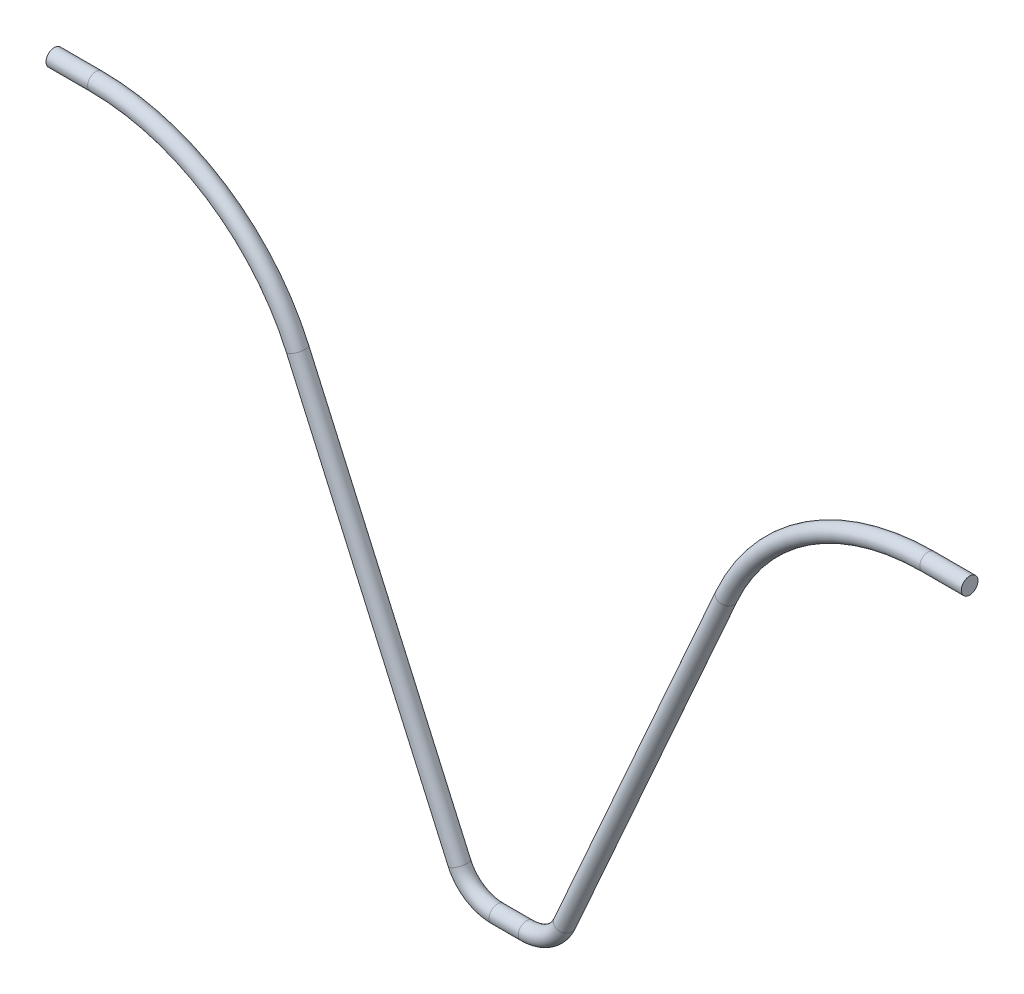
ISO-10303-21;
HEADER;
FILE_DESCRIPTION(('STEP AP214'),'2;1');
FILE_NAME('part.step','',(''),(''),'','','');
FILE_SCHEMA(('AUTOMOTIVE_DESIGN { 1 0 10303 214 1 1 1 1 }'));
ENDSEC;
DATA;
#1=APPLICATION_CONTEXT('core data for automotive mechanical design processes');
#2=APPLICATION_PROTOCOL_DEFINITION('international standard','automotive_design',2000,#1);
#3=PRODUCT_CONTEXT('',#1,'mechanical');
#4=PRODUCT('Part','Part','',(#3));
#5=PRODUCT_RELATED_PRODUCT_CATEGORY('part','',(#4));
#6=PRODUCT_DEFINITION_FORMATION('','',#4);
#7=PRODUCT_DEFINITION_CONTEXT('part definition',#1,'design');
#8=PRODUCT_DEFINITION('design','',#6,#7);
#9=PRODUCT_DEFINITION_SHAPE('','',#8);
#10=(LENGTH_UNIT() NAMED_UNIT(*) SI_UNIT(.MILLI.,.METRE.));
#11=(NAMED_UNIT(*) PLANE_ANGLE_UNIT() SI_UNIT($,.RADIAN.));
#12=(NAMED_UNIT(*) SI_UNIT($,.STERADIAN.) SOLID_ANGLE_UNIT());
#13=UNCERTAINTY_MEASURE_WITH_UNIT(LENGTH_MEASURE(1.E-05),#10,'distance_accuracy_value','');
#14=(GEOMETRIC_REPRESENTATION_CONTEXT(3) GLOBAL_UNCERTAINTY_ASSIGNED_CONTEXT((#13)) GLOBAL_UNIT_ASSIGNED_CONTEXT((#10,
#11,#12)) REPRESENTATION_CONTEXT('',''));
#15=CARTESIAN_POINT('',(0.,0.,0.));
#16=DIRECTION('',(0.,0.,1.));
#17=DIRECTION('',(1.,0.,0.));
#18=AXIS2_PLACEMENT_3D('',#15,#16,#17);
#19=CARTESIAN_POINT('',(110.,125.,0.));
#20=DIRECTION('',(1.,0.,0.));
#21=DIRECTION('',(0.,0.,-1.));
#22=AXIS2_PLACEMENT_3D('',#19,#20,#21);
#23=PLANE('',#22);
#24=CARTESIAN_POINT('',(110.,125.,0.));
#25=DIRECTION('',(1.,0.,0.));
#26=DIRECTION('',(0.,0.,-1.));
#27=AXIS2_PLACEMENT_3D('',#24,#25,#26);
#28=CIRCLE('',#27,2.);
#29=CARTESIAN_POINT('',(110.,125.,-2.));
#30=VERTEX_POINT('',#29);
#31=EDGE_CURVE('E65',#30,#30,#28,.T.);
#32=ORIENTED_EDGE('',*,*,#31,.T.);
#33=EDGE_LOOP('',(#32));
#34=FACE_BOUND('',#33,.T.);
#35=ADVANCED_FACE('F31',(#34),#23,.T.);
#36=CARTESIAN_POINT('',(-110.,125.,0.));
#37=DIRECTION('',(1.,0.,0.));
#38=DIRECTION('',(0.,0.,-1.));
#39=AXIS2_PLACEMENT_3D('',#36,#37,#38);
#40=PLANE('',#39);
#41=CARTESIAN_POINT('',(-110.,125.,0.));
#42=DIRECTION('',(1.,0.,0.));
#43=DIRECTION('',(0.,0.,-1.));
#44=AXIS2_PLACEMENT_3D('',#41,#42,#43);
#45=CIRCLE('',#44,2.);
#46=CARTESIAN_POINT('',(-110.,125.,-2.));
#47=VERTEX_POINT('',#46);
#48=EDGE_CURVE('E10',#47,#47,#45,.T.);
#49=ORIENTED_EDGE('',*,*,#48,.F.);
#50=EDGE_LOOP('',(#49));
#51=FACE_BOUND('',#50,.T.);
#52=ADVANCED_FACE('F73',(#51),#40,.F.);
#53=CARTESIAN_POINT('',(110.,125.,0.));
#54=DIRECTION('',(-1.,0.,0.));
#55=DIRECTION('',(0.,0.,1.));
#56=AXIS2_PLACEMENT_3D('',#53,#54,#55);
#57=CYLINDRICAL_SURFACE('',#56,2.);
#58=CARTESIAN_POINT('',(100.,125.,0.));
#59=DIRECTION('',(1.,0.,0.));
#60=DIRECTION('',(0.,0.,-1.));
#61=AXIS2_PLACEMENT_3D('',#58,#59,#60);
#62=CIRCLE('',#61,2.);
#63=CARTESIAN_POINT('',(100.,127.,0.));
#64=VERTEX_POINT('',#63);
#65=EDGE_CURVE('E62',#64,#64,#62,.T.);
#66=ORIENTED_EDGE('',*,*,#65,.T.);
#67=EDGE_LOOP('',(#66));
#68=FACE_BOUND('',#67,.T.);
#69=ORIENTED_EDGE('',*,*,#31,.F.);
#70=EDGE_LOOP('',(#69));
#71=FACE_BOUND('',#70,.T.);
#72=ADVANCED_FACE('F70',(#68,#71),#57,.T.);
#73=CARTESIAN_POINT('',(100.,71.9674556213017,0.));
#74=DIRECTION('',(0.,0.,1.));
#75=DIRECTION('',(1.,0.,0.));
#76=AXIS2_PLACEMENT_3D('',#73,#74,#75);
#77=TOROIDAL_SURFACE('',#76,53.0325443786983,2.);
#78=CARTESIAN_POINT('',(51.5344058402054,93.4973637961335,0.));
#79=DIRECTION('',(0.40597539543058,0.913884007029877,0.));
#80=DIRECTION('',(0.,0.,-1.));
#81=AXIS2_PLACEMENT_3D('',#78,#79,#80);
#82=CIRCLE('',#81,2.);
#83=CARTESIAN_POINT('',(49.7066378261457,94.3093145869947,0.));
#84=VERTEX_POINT('',#83);
#85=EDGE_CURVE('E59',#84,#84,#82,.T.);
#86=CARTESIAN_POINT('',(100.,71.9674556213017,0.));
#87=DIRECTION('',(0.,0.,1.));
#88=DIRECTION('',(1.,0.,0.));
#89=AXIS2_PLACEMENT_3D('',#86,#87,#88);
#90=CIRCLE('',#89,55.0325443786983);
#91=EDGE_CURVE('',#64,#84,#90,.T.);
#92=ORIENTED_EDGE('',*,*,#65,.F.);
#93=ORIENTED_EDGE('',*,*,#85,.T.);
#94=ORIENTED_EDGE('',*,*,#91,.T.);
#95=ORIENTED_EDGE('',*,*,#91,.F.);
#96=EDGE_LOOP('',(#92,#94,#93,#95));
#97=FACE_BOUND('',#96,.T.);
#98=ADVANCED_FACE('F72',(#97),#77,.T.);
#99=CARTESIAN_POINT('',(51.5344058402054,93.4973637961335,0.));
#100=DIRECTION('',(-0.40597539543058,-0.913884007029877,0.));
#101=DIRECTION('',(0.913884007029877,-0.40597539543058,0.));
#102=AXIS2_PLACEMENT_3D('',#99,#100,#101);
#103=CYLINDRICAL_SURFACE('',#102,2.);
#104=CARTESIAN_POINT('',(12.6388400702988,5.94024604569422,0.));
#105=DIRECTION('',(0.40597539543058,0.913884007029877,0.));
#106=DIRECTION('',(0.,0.,-1.));
#107=AXIS2_PLACEMENT_3D('',#104,#105,#106);
#108=CIRCLE('',#107,2.);
#109=CARTESIAN_POINT('',(14.4666080843585,5.12829525483305,0.));
#110=VERTEX_POINT('',#109);
#111=EDGE_CURVE('E56',#110,#110,#108,.T.);
#112=ORIENTED_EDGE('',*,*,#111,.T.);
#113=EDGE_LOOP('',(#112));
#114=FACE_BOUND('',#113,.T.);
#115=ORIENTED_EDGE('',*,*,#85,.F.);
#116=EDGE_LOOP('',(#115));
#117=FACE_BOUND('',#116,.T.);
#118=ADVANCED_FACE('F80',(#114,#117),#103,.T.);
#119=CARTESIAN_POINT('',(3.5,10.,0.));
#120=DIRECTION('',(0.,0.,-1.));
#121=DIRECTION('',(-1.,0.,0.));
#122=AXIS2_PLACEMENT_3D('',#119,#120,#121);
#123=TOROIDAL_SURFACE('',#122,10.,2.);
#124=CARTESIAN_POINT('',(3.49999999999998,0.,0.));
#125=DIRECTION('',(1.,0.,0.));
#126=DIRECTION('',(0.,0.,-1.));
#127=AXIS2_PLACEMENT_3D('',#124,#125,#126);
#128=CIRCLE('',#127,2.);
#129=CARTESIAN_POINT('',(3.49999999999997,-2.,0.));
#130=VERTEX_POINT('',#129);
#131=EDGE_CURVE('E53',#130,#130,#128,.T.);
#132=CARTESIAN_POINT('',(3.5,10.,0.));
#133=DIRECTION('',(0.,0.,-1.));
#134=DIRECTION('',(-1.,0.,0.));
#135=AXIS2_PLACEMENT_3D('',#132,#133,#134);
#136=CIRCLE('',#135,12.);
#137=EDGE_CURVE('',#110,#130,#136,.T.);
#138=ORIENTED_EDGE('',*,*,#111,.F.);
#139=ORIENTED_EDGE('',*,*,#131,.T.);
#140=ORIENTED_EDGE('',*,*,#137,.T.);
#141=ORIENTED_EDGE('',*,*,#137,.F.);
#142=EDGE_LOOP('',(#138,#140,#139,#141));
#143=FACE_BOUND('',#142,.T.);
#144=ADVANCED_FACE('F105',(#143),#123,.T.);
#145=CARTESIAN_POINT('',(3.5,0.,0.));
#146=DIRECTION('',(-1.,0.,0.));
#147=DIRECTION('',(0.,0.,1.));
#148=AXIS2_PLACEMENT_3D('',#145,#146,#147);
#149=CYLINDRICAL_SURFACE('',#148,2.);
#150=CARTESIAN_POINT('',(-3.5,0.,0.));
#151=DIRECTION('',(1.,0.,0.));
#152=DIRECTION('',(0.,0.,-1.));
#153=AXIS2_PLACEMENT_3D('',#150,#151,#152);
#154=CIRCLE('',#153,2.);
#155=CARTESIAN_POINT('',(-3.5,-1.99999999999998,0.));
#156=VERTEX_POINT('',#155);
#157=EDGE_CURVE('E50',#156,#156,#154,.T.);
#158=ORIENTED_EDGE('',*,*,#157,.T.);
#159=EDGE_LOOP('',(#158));
#160=FACE_BOUND('',#159,.T.);
#161=ORIENTED_EDGE('',*,*,#131,.F.);
#162=EDGE_LOOP('',(#161));
#163=FACE_BOUND('',#162,.T.);
#164=ADVANCED_FACE('F101',(#160,#163),#149,.T.);
#165=CARTESIAN_POINT('',(-3.5,10.,0.));
#166=DIRECTION('',(0.,0.,-1.));
#167=DIRECTION('',(-1.,0.,0.));
#168=AXIS2_PLACEMENT_3D('',#165,#166,#167);
#169=TOROIDAL_SURFACE('',#168,9.99999999999999,2.);
#170=CARTESIAN_POINT('',(-12.6388400702988,5.94024604569421,0.));
#171=DIRECTION('',(0.405975395430579,-0.913884007029877,0.));
#172=DIRECTION('',(0.,0.,-1.));
#173=AXIS2_PLACEMENT_3D('',#170,#171,#172);
#174=CIRCLE('',#173,2.);
#175=CARTESIAN_POINT('',(-14.4666080843585,5.12829525483305,0.));
#176=VERTEX_POINT('',#175);
#177=EDGE_CURVE('E45',#176,#176,#174,.T.);
#178=CARTESIAN_POINT('',(-3.5,10.,0.));
#179=DIRECTION('',(0.,0.,-1.));
#180=DIRECTION('',(-1.,0.,0.));
#181=AXIS2_PLACEMENT_3D('',#178,#179,#180);
#182=CIRCLE('',#181,12.);
#183=EDGE_CURVE('',#156,#176,#182,.T.);
#184=ORIENTED_EDGE('',*,*,#157,.F.);
#185=ORIENTED_EDGE('',*,*,#177,.T.);
#186=ORIENTED_EDGE('',*,*,#183,.T.);
#187=ORIENTED_EDGE('',*,*,#183,.F.);
#188=EDGE_LOOP('',(#184,#186,#185,#187));
#189=FACE_BOUND('',#188,.T.);
#190=ADVANCED_FACE('F97',(#189),#169,.T.);
#191=CARTESIAN_POINT('',(-12.6388400702988,5.94024604569424,0.));
#192=DIRECTION('',(-0.40597539543058,0.913884007029877,0.));
#193=DIRECTION('',(-0.913884007029877,-0.40597539543058,0.));
#194=AXIS2_PLACEMENT_3D('',#191,#192,#193);
#195=CYLINDRICAL_SURFACE('',#194,2.);
#196=CARTESIAN_POINT('',(-51.5344058402054,93.4973637961335,0.));
#197=DIRECTION('',(0.40597539543058,-0.913884007029877,0.));
#198=DIRECTION('',(0.,0.,-1.));
#199=AXIS2_PLACEMENT_3D('',#196,#197,#198);
#200=CIRCLE('',#199,2.);
#201=CARTESIAN_POINT('',(-49.7066378261457,94.3093145869947,0.));
#202=VERTEX_POINT('',#201);
#203=EDGE_CURVE('E41',#202,#202,#200,.T.);
#204=ORIENTED_EDGE('',*,*,#203,.T.);
#205=EDGE_LOOP('',(#204));
#206=FACE_BOUND('',#205,.T.);
#207=ORIENTED_EDGE('',*,*,#177,.F.);
#208=EDGE_LOOP('',(#207));
#209=FACE_BOUND('',#208,.T.);
#210=ADVANCED_FACE('F91',(#206,#209),#195,.T.);
#211=CARTESIAN_POINT('',(-100.,71.9674556213017,0.));
#212=DIRECTION('',(0.,0.,1.));
#213=DIRECTION('',(1.,0.,0.));
#214=AXIS2_PLACEMENT_3D('',#211,#212,#213);
#215=TOROIDAL_SURFACE('',#214,53.0325443786983,2.);
#216=CARTESIAN_POINT('',(-100.,125.,0.));
#217=DIRECTION('',(1.,0.,0.));
#218=DIRECTION('',(0.,0.,-1.));
#219=AXIS2_PLACEMENT_3D('',#216,#217,#218);
#220=CIRCLE('',#219,2.);
#221=CARTESIAN_POINT('',(-100.,127.,0.));
#222=VERTEX_POINT('',#221);
#223=EDGE_CURVE('E37',#222,#222,#220,.T.);
#224=CARTESIAN_POINT('',(-100.,71.9674556213017,0.));
#225=DIRECTION('',(0.,0.,1.));
#226=DIRECTION('',(1.,0.,0.));
#227=AXIS2_PLACEMENT_3D('',#224,#225,#226);
#228=CIRCLE('',#227,55.0325443786983);
#229=EDGE_CURVE('',#202,#222,#228,.T.);
#230=ORIENTED_EDGE('',*,*,#203,.F.);
#231=ORIENTED_EDGE('',*,*,#223,.T.);
#232=ORIENTED_EDGE('',*,*,#229,.T.);
#233=ORIENTED_EDGE('',*,*,#229,.F.);
#234=EDGE_LOOP('',(#230,#232,#231,#233));
#235=FACE_BOUND('',#234,.T.);
#236=ADVANCED_FACE('F86',(#235),#215,.T.);
#237=CARTESIAN_POINT('',(-100.,125.,0.));
#238=DIRECTION('',(-1.,0.,0.));
#239=DIRECTION('',(0.,0.,1.));
#240=AXIS2_PLACEMENT_3D('',#237,#238,#239);
#241=CYLINDRICAL_SURFACE('',#240,2.);
#242=ORIENTED_EDGE('',*,*,#48,.T.);
#243=EDGE_LOOP('',(#242));
#244=FACE_BOUND('',#243,.T.);
#245=ORIENTED_EDGE('',*,*,#223,.F.);
#246=EDGE_LOOP('',(#245));
#247=FACE_BOUND('',#246,.T.);
#248=ADVANCED_FACE('F84',(#244,#247),#241,.T.);
#249=CLOSED_SHELL('',(#35,#52,#72,#98,#118,#144,#164,#190,#210,#236,#248));
#250=MANIFOLD_SOLID_BREP('B2',#249);
#251=ADVANCED_BREP_SHAPE_REPRESENTATION('',(#18,#250),#14);
#252=SHAPE_DEFINITION_REPRESENTATION(#9,#251);
ENDSEC;
END-ISO-10303-21;
